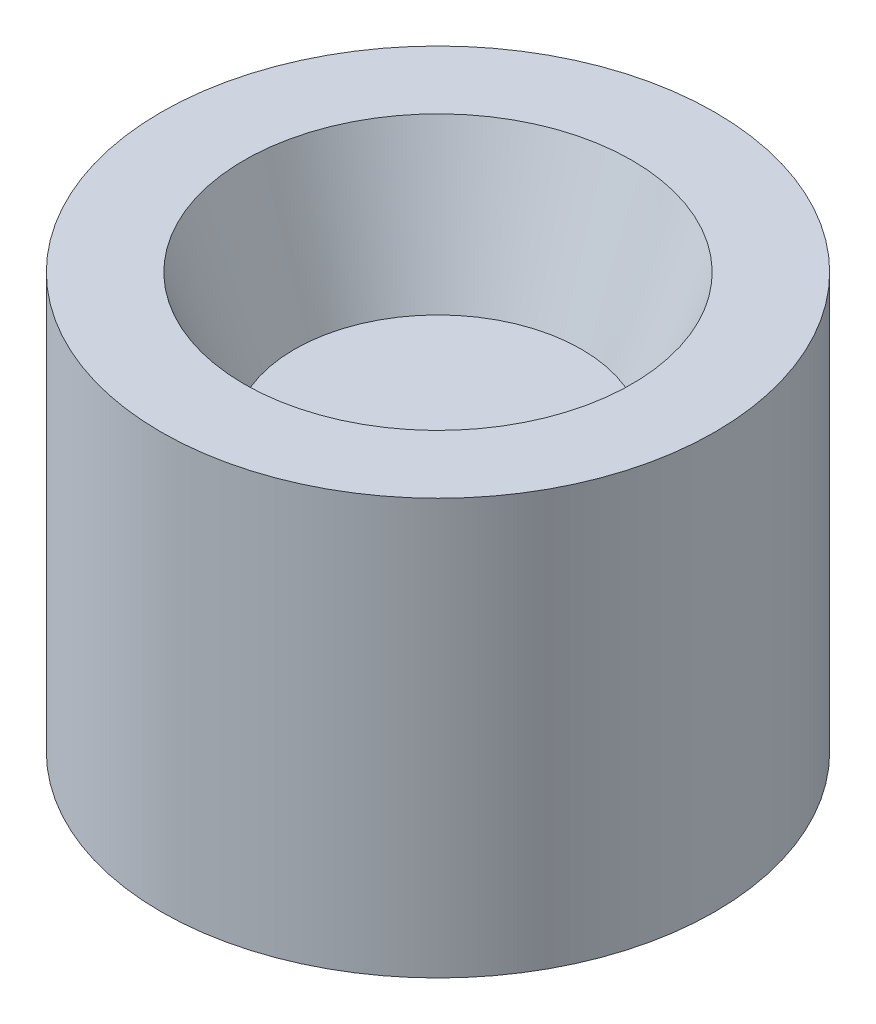
ISO-10303-21;
HEADER;
FILE_DESCRIPTION(('STEP AP214'),'2;1');
FILE_NAME('part.step','',(''),(''),'','','');
FILE_SCHEMA(('AUTOMOTIVE_DESIGN { 1 0 10303 214 1 1 1 1 }'));
ENDSEC;
DATA;
#1=APPLICATION_CONTEXT('core data for automotive mechanical design processes');
#2=APPLICATION_PROTOCOL_DEFINITION('international standard','automotive_design',2000,#1);
#3=PRODUCT_CONTEXT('',#1,'mechanical');
#4=PRODUCT('Part','Part','',(#3));
#5=PRODUCT_RELATED_PRODUCT_CATEGORY('part','',(#4));
#6=PRODUCT_DEFINITION_FORMATION('','',#4);
#7=PRODUCT_DEFINITION_CONTEXT('part definition',#1,'design');
#8=PRODUCT_DEFINITION('design','',#6,#7);
#9=PRODUCT_DEFINITION_SHAPE('','',#8);
#10=(LENGTH_UNIT() NAMED_UNIT(*) SI_UNIT(.MILLI.,.METRE.));
#11=(NAMED_UNIT(*) PLANE_ANGLE_UNIT() SI_UNIT($,.RADIAN.));
#12=(NAMED_UNIT(*) SI_UNIT($,.STERADIAN.) SOLID_ANGLE_UNIT());
#13=UNCERTAINTY_MEASURE_WITH_UNIT(LENGTH_MEASURE(1.E-05),#10,'distance_accuracy_value','');
#14=(GEOMETRIC_REPRESENTATION_CONTEXT(3) GLOBAL_UNCERTAINTY_ASSIGNED_CONTEXT((#13)) GLOBAL_UNIT_ASSIGNED_CONTEXT((#10,
#11,#12)) REPRESENTATION_CONTEXT('',''));
#15=CARTESIAN_POINT('',(0.,0.,0.));
#16=DIRECTION('',(0.,0.,1.));
#17=DIRECTION('',(1.,0.,0.));
#18=AXIS2_PLACEMENT_3D('',#15,#16,#17);
#19=CARTESIAN_POINT('',(6.57878901240964,0.,0.));
#20=DIRECTION('',(0.,-1.,0.));
#21=DIRECTION('',(0.,0.,-1.));
#22=AXIS2_PLACEMENT_3D('',#19,#20,#21);
#23=PLANE('',#22);
#24=CARTESIAN_POINT('',(0.,0.,0.));
#25=DIRECTION('',(0.,-1.,0.));
#26=DIRECTION('',(0.,0.,-1.));
#27=AXIS2_PLACEMENT_3D('',#24,#25,#26);
#28=CIRCLE('',#27,6.57878901240964);
#29=CARTESIAN_POINT('',(0.,0.,-6.57878901240964));
#30=VERTEX_POINT('',#29);
#31=EDGE_CURVE('E70',#30,#30,#28,.T.);
#32=ORIENTED_EDGE('',*,*,#31,.T.);
#33=EDGE_LOOP('',(#32));
#34=FACE_BOUND('',#33,.T.);
#35=ADVANCED_FACE('F43',(#34),#23,.T.);
#36=CARTESIAN_POINT('',(0.,6.35,0.));
#37=DIRECTION('',(0.,1.,0.));
#38=DIRECTION('',(0.,0.,1.));
#39=AXIS2_PLACEMENT_3D('',#36,#37,#38);
#40=PLANE('',#39);
#41=CARTESIAN_POINT('',(0.,6.35,0.));
#42=DIRECTION('',(0.,-1.,0.));
#43=DIRECTION('',(0.,0.,-1.));
#44=AXIS2_PLACEMENT_3D('',#41,#42,#43);
#45=CIRCLE('',#44,6.57878901240964);
#46=CARTESIAN_POINT('',(0.,6.35,-6.57878901240964));
#47=VERTEX_POINT('',#46);
#48=EDGE_CURVE('E10',#47,#47,#45,.T.);
#49=ORIENTED_EDGE('',*,*,#48,.F.);
#50=EDGE_LOOP('',(#49));
#51=FACE_BOUND('',#50,.T.);
#52=ADVANCED_FACE('F88',(#51),#40,.T.);
#53=CARTESIAN_POINT('',(0.,12.7,0.));
#54=DIRECTION('',(0.,1.,0.));
#55=DIRECTION('',(0.,0.,1.));
#56=AXIS2_PLACEMENT_3D('',#53,#54,#55);
#57=CONICAL_SURFACE('',#56,8.89,0.349065850398863);
#58=ORIENTED_EDGE('',*,*,#48,.T.);
#59=EDGE_LOOP('',(#58));
#60=FACE_BOUND('',#59,.T.);
#61=CARTESIAN_POINT('',(0.,12.7,0.));
#62=DIRECTION('',(0.,-1.,0.));
#63=DIRECTION('',(0.,0.,-1.));
#64=AXIS2_PLACEMENT_3D('',#61,#62,#63);
#65=CIRCLE('',#64,8.89);
#66=CARTESIAN_POINT('',(0.,12.7,-8.89));
#67=VERTEX_POINT('',#66);
#68=EDGE_CURVE('E50',#67,#67,#65,.T.);
#69=ORIENTED_EDGE('',*,*,#68,.F.);
#70=EDGE_LOOP('',(#69));
#71=FACE_BOUND('',#70,.T.);
#72=ADVANCED_FACE('F92',(#60,#71),#57,.F.);
#73=CARTESIAN_POINT('',(8.89,12.7,0.));
#74=DIRECTION('',(0.,1.,0.));
#75=DIRECTION('',(0.,0.,1.));
#76=AXIS2_PLACEMENT_3D('',#73,#74,#75);
#77=PLANE('',#76);
#78=ORIENTED_EDGE('',*,*,#68,.T.);
#79=EDGE_LOOP('',(#78));
#80=FACE_BOUND('',#79,.T.);
#81=CARTESIAN_POINT('',(0.,12.7,0.));
#82=DIRECTION('',(0.,-1.,0.));
#83=DIRECTION('',(0.,0.,-1.));
#84=AXIS2_PLACEMENT_3D('',#81,#82,#83);
#85=CIRCLE('',#84,12.7);
#86=CARTESIAN_POINT('',(0.,12.7,-12.7));
#87=VERTEX_POINT('',#86);
#88=EDGE_CURVE('E55',#87,#87,#85,.T.);
#89=ORIENTED_EDGE('',*,*,#88,.F.);
#90=EDGE_LOOP('',(#89));
#91=FACE_BOUND('',#90,.T.);
#92=ADVANCED_FACE('F97',(#80,#91),#77,.T.);
#93=CARTESIAN_POINT('',(0.,0.,0.));
#94=DIRECTION('',(0.,-1.,0.));
#95=DIRECTION('',(0.,0.,-1.));
#96=AXIS2_PLACEMENT_3D('',#93,#94,#95);
#97=CYLINDRICAL_SURFACE('',#96,12.7);
#98=ORIENTED_EDGE('',*,*,#88,.T.);
#99=EDGE_LOOP('',(#98));
#100=FACE_BOUND('',#99,.T.);
#101=CARTESIAN_POINT('',(0.,-6.35,0.));
#102=DIRECTION('',(0.,-1.,0.));
#103=DIRECTION('',(0.,0.,-1.));
#104=AXIS2_PLACEMENT_3D('',#101,#102,#103);
#105=CIRCLE('',#104,12.7);
#106=CARTESIAN_POINT('',(0.,-6.35,-12.7));
#107=VERTEX_POINT('',#106);
#108=EDGE_CURVE('E60',#107,#107,#105,.T.);
#109=ORIENTED_EDGE('',*,*,#108,.F.);
#110=EDGE_LOOP('',(#109));
#111=FACE_BOUND('',#110,.T.);
#112=ADVANCED_FACE('F84',(#100,#111),#97,.T.);
#113=CARTESIAN_POINT('',(12.7,-6.35,0.));
#114=DIRECTION('',(0.,-1.,0.));
#115=DIRECTION('',(0.,0.,-1.));
#116=AXIS2_PLACEMENT_3D('',#113,#114,#115);
#117=PLANE('',#116);
#118=ORIENTED_EDGE('',*,*,#108,.T.);
#119=EDGE_LOOP('',(#118));
#120=FACE_BOUND('',#119,.T.);
#121=CARTESIAN_POINT('',(0.,-6.35,0.));
#122=DIRECTION('',(0.,-1.,0.));
#123=DIRECTION('',(0.,0.,-1.));
#124=AXIS2_PLACEMENT_3D('',#121,#122,#123);
#125=CIRCLE('',#124,8.89);
#126=CARTESIAN_POINT('',(0.,-6.35,-8.89));
#127=VERTEX_POINT('',#126);
#128=EDGE_CURVE('E66',#127,#127,#125,.T.);
#129=ORIENTED_EDGE('',*,*,#128,.F.);
#130=EDGE_LOOP('',(#129));
#131=FACE_BOUND('',#130,.T.);
#132=ADVANCED_FACE('F78',(#120,#131),#117,.T.);
#133=CARTESIAN_POINT('',(0.,0.,0.));
#134=DIRECTION('',(0.,-1.,0.));
#135=DIRECTION('',(0.,0.,-1.));
#136=AXIS2_PLACEMENT_3D('',#133,#134,#135);
#137=CONICAL_SURFACE('',#136,6.57878901240964,0.349065850398863);
#138=ORIENTED_EDGE('',*,*,#128,.T.);
#139=EDGE_LOOP('',(#138));
#140=FACE_BOUND('',#139,.T.);
#141=ORIENTED_EDGE('',*,*,#31,.F.);
#142=EDGE_LOOP('',(#141));
#143=FACE_BOUND('',#142,.T.);
#144=ADVANCED_FACE('F76',(#140,#143),#137,.F.);
#145=CLOSED_SHELL('',(#35,#52,#72,#92,#112,#132,#144));
#146=MANIFOLD_SOLID_BREP('B2',#145);
#147=ADVANCED_BREP_SHAPE_REPRESENTATION('',(#18,#146),#14);
#148=SHAPE_DEFINITION_REPRESENTATION(#9,#147);
ENDSEC;
END-ISO-10303-21;
